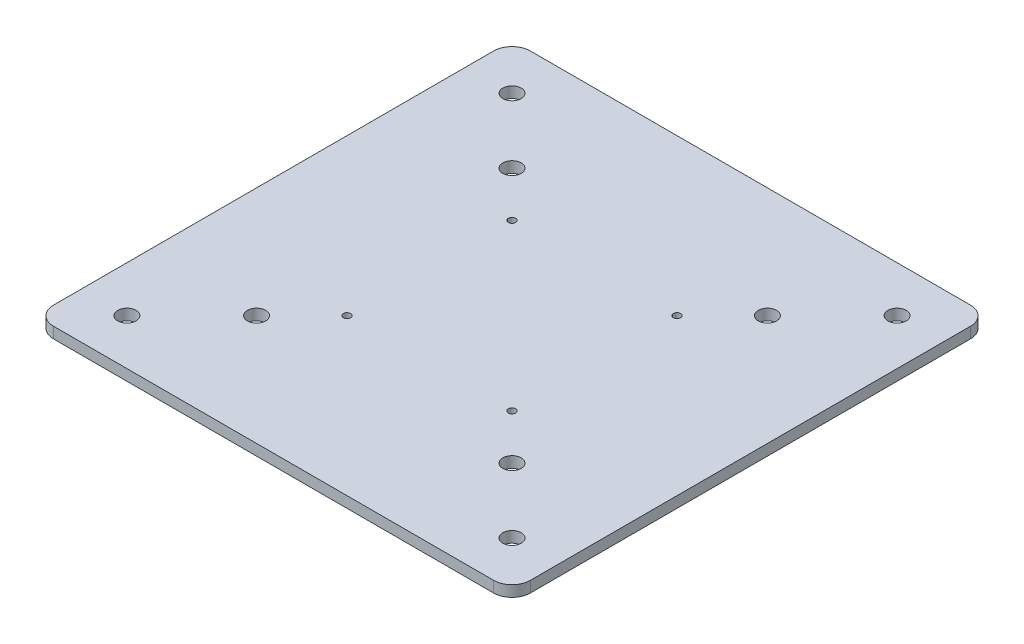
ISO-10303-21;
HEADER;
FILE_DESCRIPTION(('STEP AP214'),'2;1');
FILE_NAME('part.step','',(''),(''),'','','');
FILE_SCHEMA(('AUTOMOTIVE_DESIGN { 1 0 10303 214 1 1 1 1 }'));
ENDSEC;
DATA;
#1=APPLICATION_CONTEXT('core data for automotive mechanical design processes');
#2=APPLICATION_PROTOCOL_DEFINITION('international standard','automotive_design',2000,#1);
#3=PRODUCT_CONTEXT('',#1,'mechanical');
#4=PRODUCT('Part','Part','',(#3));
#5=PRODUCT_RELATED_PRODUCT_CATEGORY('part','',(#4));
#6=PRODUCT_DEFINITION_FORMATION('','',#4);
#7=PRODUCT_DEFINITION_CONTEXT('part definition',#1,'design');
#8=PRODUCT_DEFINITION('design','',#6,#7);
#9=PRODUCT_DEFINITION_SHAPE('','',#8);
#10=(LENGTH_UNIT() NAMED_UNIT(*) SI_UNIT(.MILLI.,.METRE.));
#11=(NAMED_UNIT(*) PLANE_ANGLE_UNIT() SI_UNIT($,.RADIAN.));
#12=(NAMED_UNIT(*) SI_UNIT($,.STERADIAN.) SOLID_ANGLE_UNIT());
#13=UNCERTAINTY_MEASURE_WITH_UNIT(LENGTH_MEASURE(1.E-05),#10,'distance_accuracy_value','');
#14=(GEOMETRIC_REPRESENTATION_CONTEXT(3) GLOBAL_UNCERTAINTY_ASSIGNED_CONTEXT((#13)) GLOBAL_UNIT_ASSIGNED_CONTEXT((#10,
#11,#12)) REPRESENTATION_CONTEXT('',''));
#15=CARTESIAN_POINT('',(0.,0.,0.));
#16=DIRECTION('',(0.,0.,1.));
#17=DIRECTION('',(1.,0.,0.));
#18=AXIS2_PLACEMENT_3D('',#15,#16,#17);
#19=CARTESIAN_POINT('',(0.,3.,0.));
#20=DIRECTION('',(0.,1.,0.));
#21=DIRECTION('',(0.,0.,1.));
#22=AXIS2_PLACEMENT_3D('',#19,#20,#21);
#23=PLANE('',#22);
#24=CARTESIAN_POINT('',(22.5,3.,22.4999999999999));
#25=DIRECTION('',(0.,1.,0.));
#26=DIRECTION('',(0.,0.,-1.));
#27=AXIS2_PLACEMENT_3D('',#24,#25,#26);
#28=CIRCLE('',#27,1.);
#29=CARTESIAN_POINT('',(22.5,3.,21.4999999999999));
#30=VERTEX_POINT('',#29);
#31=EDGE_CURVE('E309',#30,#30,#28,.T.);
#32=ORIENTED_EDGE('',*,*,#31,.F.);
#33=EDGE_LOOP('',(#32));
#34=FACE_BOUND('',#33,.T.);
#35=CARTESIAN_POINT('',(-22.5,3.,-22.5));
#36=DIRECTION('',(0.,1.,0.));
#37=DIRECTION('',(0.,0.,1.));
#38=AXIS2_PLACEMENT_3D('',#35,#36,#37);
#39=CIRCLE('',#38,1.);
#40=CARTESIAN_POINT('',(-22.5,3.,-21.5));
#41=VERTEX_POINT('',#40);
#42=EDGE_CURVE('E290',#41,#41,#39,.T.);
#43=ORIENTED_EDGE('',*,*,#42,.F.);
#44=EDGE_LOOP('',(#43));
#45=FACE_BOUND('',#44,.T.);
#46=CARTESIAN_POINT('',(-34.8223304703363,3.,34.8223304703363));
#47=DIRECTION('',(0.,1.,0.));
#48=DIRECTION('',(0.,0.,-1.));
#49=AXIS2_PLACEMENT_3D('',#46,#47,#48);
#50=CIRCLE('',#49,2.50000000000003);
#51=CARTESIAN_POINT('',(-34.8223304703363,3.,32.3223304703362));
#52=VERTEX_POINT('',#51);
#53=EDGE_CURVE('E273',#52,#52,#50,.T.);
#54=ORIENTED_EDGE('',*,*,#53,.F.);
#55=EDGE_LOOP('',(#54));
#56=FACE_BOUND('',#55,.T.);
#57=CARTESIAN_POINT('',(52.5,3.,52.4999999999999));
#58=DIRECTION('',(0.,1.,0.));
#59=DIRECTION('',(0.,0.,-1.));
#60=AXIS2_PLACEMENT_3D('',#57,#58,#59);
#61=CIRCLE('',#60,2.5);
#62=CARTESIAN_POINT('',(52.5,3.,49.9999999999999));
#63=VERTEX_POINT('',#62);
#64=EDGE_CURVE('E257',#63,#63,#61,.T.);
#65=ORIENTED_EDGE('',*,*,#64,.F.);
#66=EDGE_LOOP('',(#65));
#67=FACE_BOUND('',#66,.T.);
#68=CARTESIAN_POINT('',(34.8223304703363,3.,-34.8223304703363));
#69=DIRECTION('',(0.,1.,0.));
#70=DIRECTION('',(0.,0.,1.));
#71=AXIS2_PLACEMENT_3D('',#68,#69,#70);
#72=CIRCLE('',#71,2.5);
#73=CARTESIAN_POINT('',(34.8223304703363,3.,-32.3223304703363));
#74=VERTEX_POINT('',#73);
#75=EDGE_CURVE('E234',#74,#74,#72,.T.);
#76=ORIENTED_EDGE('',*,*,#75,.F.);
#77=EDGE_LOOP('',(#76));
#78=FACE_BOUND('',#77,.T.);
#79=CARTESIAN_POINT('',(-52.5,3.,-52.5));
#80=DIRECTION('',(0.,1.,0.));
#81=DIRECTION('',(0.,0.,1.));
#82=AXIS2_PLACEMENT_3D('',#79,#80,#81);
#83=CIRCLE('',#82,2.5);
#84=CARTESIAN_POINT('',(-52.5,3.,-50.));
#85=VERTEX_POINT('',#84);
#86=EDGE_CURVE('E217',#85,#85,#83,.T.);
#87=ORIENTED_EDGE('',*,*,#86,.F.);
#88=EDGE_LOOP('',(#87));
#89=FACE_BOUND('',#88,.T.);
#90=DIRECTION('',(0.,0.,1.));
#91=VECTOR('',#90,1.);
#92=CARTESIAN_POINT('',(-65.,3.,-65.));
#93=LINE('',#92,#91);
#94=CARTESIAN_POINT('',(-65.,3.,-60.));
#95=VERTEX_POINT('',#94);
#96=CARTESIAN_POINT('',(-65.,3.,60.));
#97=VERTEX_POINT('',#96);
#98=EDGE_CURVE('E179',#95,#97,#93,.T.);
#99=ORIENTED_EDGE('',*,*,#98,.T.);
#100=CARTESIAN_POINT('',(-60.,3.,60.));
#101=DIRECTION('',(0.,1.,0.));
#102=DIRECTION('',(0.,0.,1.));
#103=AXIS2_PLACEMENT_3D('',#100,#101,#102);
#104=CIRCLE('',#103,5.);
#105=CARTESIAN_POINT('',(-60.,3.,65.));
#106=VERTEX_POINT('',#105);
#107=EDGE_CURVE('E195',#97,#106,#104,.T.);
#108=ORIENTED_EDGE('',*,*,#107,.T.);
#109=DIRECTION('',(1.,0.,0.));
#110=VECTOR('',#109,1.);
#111=CARTESIAN_POINT('',(-65.,3.,65.));
#112=LINE('',#111,#110);
#113=CARTESIAN_POINT('',(60.,3.,65.));
#114=VERTEX_POINT('',#113);
#115=EDGE_CURVE('E129',#106,#114,#112,.T.);
#116=ORIENTED_EDGE('',*,*,#115,.T.);
#117=CARTESIAN_POINT('',(60.,3.,60.));
#118=DIRECTION('',(0.,1.,0.));
#119=DIRECTION('',(0.,0.,1.));
#120=AXIS2_PLACEMENT_3D('',#117,#118,#119);
#121=CIRCLE('',#120,5.);
#122=CARTESIAN_POINT('',(65.,3.,60.));
#123=VERTEX_POINT('',#122);
#124=EDGE_CURVE('E200',#114,#123,#121,.T.);
#125=ORIENTED_EDGE('',*,*,#124,.T.);
#126=DIRECTION('',(0.,0.,-1.));
#127=VECTOR('',#126,1.);
#128=CARTESIAN_POINT('',(65.,3.,-65.));
#129=LINE('',#128,#127);
#130=CARTESIAN_POINT('',(65.,3.,-60.));
#131=VERTEX_POINT('',#130);
#132=EDGE_CURVE('E138',#123,#131,#129,.T.);
#133=ORIENTED_EDGE('',*,*,#132,.T.);
#134=CARTESIAN_POINT('',(60.,3.,-60.));
#135=DIRECTION('',(0.,1.,0.));
#136=DIRECTION('',(0.,0.,1.));
#137=AXIS2_PLACEMENT_3D('',#134,#135,#136);
#138=CIRCLE('',#137,5.);
#139=CARTESIAN_POINT('',(60.,3.,-65.));
#140=VERTEX_POINT('',#139);
#141=EDGE_CURVE('E63',#131,#140,#138,.T.);
#142=ORIENTED_EDGE('',*,*,#141,.T.);
#143=DIRECTION('',(-1.,0.,0.));
#144=VECTOR('',#143,1.);
#145=CARTESIAN_POINT('',(-65.,3.,-65.));
#146=LINE('',#145,#144);
#147=CARTESIAN_POINT('',(-60.,3.,-65.));
#148=VERTEX_POINT('',#147);
#149=EDGE_CURVE('E143',#140,#148,#146,.T.);
#150=ORIENTED_EDGE('',*,*,#149,.T.);
#151=CARTESIAN_POINT('',(-60.,3.,-60.));
#152=DIRECTION('',(0.,1.,0.));
#153=DIRECTION('',(0.,0.,1.));
#154=AXIS2_PLACEMENT_3D('',#151,#152,#153);
#155=CIRCLE('',#154,5.);
#156=EDGE_CURVE('E166',#148,#95,#155,.T.);
#157=ORIENTED_EDGE('',*,*,#156,.T.);
#158=EDGE_LOOP('',(#99,#108,#116,#125,#133,#142,#150,#157));
#159=FACE_BOUND('',#158,.T.);
#160=CARTESIAN_POINT('',(-34.8223304703363,3.,-34.8223304703364));
#161=DIRECTION('',(0.,1.,0.));
#162=DIRECTION('',(0.,0.,1.));
#163=AXIS2_PLACEMENT_3D('',#160,#161,#162);
#164=CIRCLE('',#163,2.5);
#165=CARTESIAN_POINT('',(-34.8223304703363,3.,-32.3223304703364));
#166=VERTEX_POINT('',#165);
#167=EDGE_CURVE('E227',#166,#166,#164,.T.);
#168=ORIENTED_EDGE('',*,*,#167,.F.);
#169=EDGE_LOOP('',(#168));
#170=FACE_BOUND('',#169,.T.);
#171=CARTESIAN_POINT('',(52.5,3.,-52.5));
#172=DIRECTION('',(0.,1.,0.));
#173=DIRECTION('',(0.,0.,1.));
#174=AXIS2_PLACEMENT_3D('',#171,#172,#173);
#175=CIRCLE('',#174,2.5);
#176=CARTESIAN_POINT('',(52.5,3.,-50.));
#177=VERTEX_POINT('',#176);
#178=EDGE_CURVE('E246',#177,#177,#175,.T.);
#179=ORIENTED_EDGE('',*,*,#178,.F.);
#180=EDGE_LOOP('',(#179));
#181=FACE_BOUND('',#180,.T.);
#182=CARTESIAN_POINT('',(34.8223304703363,3.,34.8223304703362));
#183=DIRECTION('',(0.,1.,0.));
#184=DIRECTION('',(0.,0.,-1.));
#185=AXIS2_PLACEMENT_3D('',#182,#183,#184);
#186=CIRCLE('',#185,2.5);
#187=CARTESIAN_POINT('',(34.8223304703363,3.,32.3223304703362));
#188=VERTEX_POINT('',#187);
#189=EDGE_CURVE('E272',#188,#188,#186,.T.);
#190=ORIENTED_EDGE('',*,*,#189,.F.);
#191=EDGE_LOOP('',(#190));
#192=FACE_BOUND('',#191,.T.);
#193=CARTESIAN_POINT('',(-52.5,3.,52.5));
#194=DIRECTION('',(0.,1.,0.));
#195=DIRECTION('',(0.,0.,-1.));
#196=AXIS2_PLACEMENT_3D('',#193,#194,#195);
#197=CIRCLE('',#196,2.50000000000002);
#198=CARTESIAN_POINT('',(-52.5,3.,49.9999999999999));
#199=VERTEX_POINT('',#198);
#200=EDGE_CURVE('E281',#199,#199,#197,.T.);
#201=ORIENTED_EDGE('',*,*,#200,.F.);
#202=EDGE_LOOP('',(#201));
#203=FACE_BOUND('',#202,.T.);
#204=CARTESIAN_POINT('',(22.5,3.,-22.5));
#205=DIRECTION('',(0.,1.,0.));
#206=DIRECTION('',(0.,0.,1.));
#207=AXIS2_PLACEMENT_3D('',#204,#205,#206);
#208=CIRCLE('',#207,1.);
#209=CARTESIAN_POINT('',(22.5,3.,-21.5));
#210=VERTEX_POINT('',#209);
#211=EDGE_CURVE('E298',#210,#210,#208,.T.);
#212=ORIENTED_EDGE('',*,*,#211,.F.);
#213=EDGE_LOOP('',(#212));
#214=FACE_BOUND('',#213,.T.);
#215=CARTESIAN_POINT('',(-22.5,3.,22.4999999999999));
#216=DIRECTION('',(0.,1.,0.));
#217=DIRECTION('',(0.,0.,-1.));
#218=AXIS2_PLACEMENT_3D('',#215,#216,#217);
#219=CIRCLE('',#218,1.);
#220=CARTESIAN_POINT('',(-22.5,3.,21.4999999999999));
#221=VERTEX_POINT('',#220);
#222=EDGE_CURVE('E321',#221,#221,#219,.T.);
#223=ORIENTED_EDGE('',*,*,#222,.F.);
#224=EDGE_LOOP('',(#223));
#225=FACE_BOUND('',#224,.T.);
#226=ADVANCED_FACE('F42',(#34,#45,#56,#67,#78,#89,#159,#170,#181,#192,#203,#214,#225),#23,.T.);
#227=CARTESIAN_POINT('',(0.,0.,0.));
#228=DIRECTION('',(0.,1.,0.));
#229=DIRECTION('',(0.,0.,1.));
#230=AXIS2_PLACEMENT_3D('',#227,#228,#229);
#231=PLANE('',#230);
#232=DIRECTION('',(1.,0.,0.));
#233=VECTOR('',#232,1.);
#234=CARTESIAN_POINT('',(-65.,0.,65.));
#235=LINE('',#234,#233);
#236=CARTESIAN_POINT('',(-60.,0.,65.));
#237=VERTEX_POINT('',#236);
#238=CARTESIAN_POINT('',(60.,0.,65.));
#239=VERTEX_POINT('',#238);
#240=EDGE_CURVE('E126',#237,#239,#235,.T.);
#241=ORIENTED_EDGE('',*,*,#240,.F.);
#242=CARTESIAN_POINT('',(-60.,0.,60.));
#243=DIRECTION('',(0.,1.,0.));
#244=DIRECTION('',(0.,0.,1.));
#245=AXIS2_PLACEMENT_3D('',#242,#243,#244);
#246=CIRCLE('',#245,5.);
#247=CARTESIAN_POINT('',(-65.,0.,60.));
#248=VERTEX_POINT('',#247);
#249=EDGE_CURVE('E108',#237,#248,#246,.F.);
#250=ORIENTED_EDGE('',*,*,#249,.T.);
#251=DIRECTION('',(0.,0.,1.));
#252=VECTOR('',#251,1.);
#253=CARTESIAN_POINT('',(-65.,0.,-65.));
#254=LINE('',#253,#252);
#255=CARTESIAN_POINT('',(-65.,0.,-60.));
#256=VERTEX_POINT('',#255);
#257=EDGE_CURVE('E139',#256,#248,#254,.T.);
#258=ORIENTED_EDGE('',*,*,#257,.F.);
#259=CARTESIAN_POINT('',(-60.,0.,-60.));
#260=DIRECTION('',(0.,1.,0.));
#261=DIRECTION('',(0.,0.,1.));
#262=AXIS2_PLACEMENT_3D('',#259,#260,#261);
#263=CIRCLE('',#262,5.);
#264=CARTESIAN_POINT('',(-60.,0.,-65.));
#265=VERTEX_POINT('',#264);
#266=EDGE_CURVE('E153',#256,#265,#263,.F.);
#267=ORIENTED_EDGE('',*,*,#266,.T.);
#268=DIRECTION('',(-1.,0.,0.));
#269=VECTOR('',#268,1.);
#270=CARTESIAN_POINT('',(-65.,0.,-65.));
#271=LINE('',#270,#269);
#272=CARTESIAN_POINT('',(60.,0.,-65.));
#273=VERTEX_POINT('',#272);
#274=EDGE_CURVE('E145',#273,#265,#271,.T.);
#275=ORIENTED_EDGE('',*,*,#274,.F.);
#276=CARTESIAN_POINT('',(60.,0.,-60.));
#277=DIRECTION('',(0.,1.,0.));
#278=DIRECTION('',(0.,0.,1.));
#279=AXIS2_PLACEMENT_3D('',#276,#277,#278);
#280=CIRCLE('',#279,5.);
#281=CARTESIAN_POINT('',(65.,0.,-60.));
#282=VERTEX_POINT('',#281);
#283=EDGE_CURVE('E131',#273,#282,#280,.F.);
#284=ORIENTED_EDGE('',*,*,#283,.T.);
#285=DIRECTION('',(0.,0.,-1.));
#286=VECTOR('',#285,1.);
#287=CARTESIAN_POINT('',(65.,0.,-65.));
#288=LINE('',#287,#286);
#289=CARTESIAN_POINT('',(65.,0.,60.));
#290=VERTEX_POINT('',#289);
#291=EDGE_CURVE('E215',#290,#282,#288,.T.);
#292=ORIENTED_EDGE('',*,*,#291,.F.);
#293=CARTESIAN_POINT('',(60.,0.,60.));
#294=DIRECTION('',(0.,1.,0.));
#295=DIRECTION('',(0.,0.,1.));
#296=AXIS2_PLACEMENT_3D('',#293,#294,#295);
#297=CIRCLE('',#296,5.);
#298=EDGE_CURVE('E120',#290,#239,#297,.F.);
#299=ORIENTED_EDGE('',*,*,#298,.T.);
#300=EDGE_LOOP('',(#241,#250,#258,#267,#275,#284,#292,#299));
#301=FACE_BOUND('',#300,.T.);
#302=CARTESIAN_POINT('',(-52.5,0.,-52.5));
#303=DIRECTION('',(0.,1.,0.));
#304=DIRECTION('',(0.,0.,1.));
#305=AXIS2_PLACEMENT_3D('',#302,#303,#304);
#306=CIRCLE('',#305,2.5);
#307=CARTESIAN_POINT('',(-52.5,0.,-50.));
#308=VERTEX_POINT('',#307);
#309=EDGE_CURVE('E222',#308,#308,#306,.T.);
#310=ORIENTED_EDGE('',*,*,#309,.T.);
#311=EDGE_LOOP('',(#310));
#312=FACE_BOUND('',#311,.T.);
#313=CARTESIAN_POINT('',(-34.8223304703363,0.,-34.8223304703364));
#314=DIRECTION('',(0.,1.,0.));
#315=DIRECTION('',(0.,0.,1.));
#316=AXIS2_PLACEMENT_3D('',#313,#314,#315);
#317=CIRCLE('',#316,2.5);
#318=CARTESIAN_POINT('',(-34.8223304703363,0.,-32.3223304703364));
#319=VERTEX_POINT('',#318);
#320=EDGE_CURVE('E230',#319,#319,#317,.T.);
#321=ORIENTED_EDGE('',*,*,#320,.T.);
#322=EDGE_LOOP('',(#321));
#323=FACE_BOUND('',#322,.T.);
#324=CARTESIAN_POINT('',(34.8223304703363,0.,-34.8223304703363));
#325=DIRECTION('',(0.,1.,0.));
#326=DIRECTION('',(0.,0.,1.));
#327=AXIS2_PLACEMENT_3D('',#324,#325,#326);
#328=CIRCLE('',#327,2.5);
#329=CARTESIAN_POINT('',(34.8223304703363,0.,-32.3223304703363));
#330=VERTEX_POINT('',#329);
#331=EDGE_CURVE('E239',#330,#330,#328,.T.);
#332=ORIENTED_EDGE('',*,*,#331,.T.);
#333=EDGE_LOOP('',(#332));
#334=FACE_BOUND('',#333,.T.);
#335=CARTESIAN_POINT('',(52.5,0.,-52.5));
#336=DIRECTION('',(0.,1.,0.));
#337=DIRECTION('',(0.,0.,1.));
#338=AXIS2_PLACEMENT_3D('',#335,#336,#337);
#339=CIRCLE('',#338,2.5);
#340=CARTESIAN_POINT('',(52.5,0.,-50.));
#341=VERTEX_POINT('',#340);
#342=EDGE_CURVE('E252',#341,#341,#339,.T.);
#343=ORIENTED_EDGE('',*,*,#342,.T.);
#344=EDGE_LOOP('',(#343));
#345=FACE_BOUND('',#344,.T.);
#346=CARTESIAN_POINT('',(52.5,0.,52.4999999999999));
#347=DIRECTION('',(0.,1.,0.));
#348=DIRECTION('',(0.,0.,-1.));
#349=AXIS2_PLACEMENT_3D('',#346,#347,#348);
#350=CIRCLE('',#349,2.5);
#351=CARTESIAN_POINT('',(52.5,0.,49.9999999999999));
#352=VERTEX_POINT('',#351);
#353=EDGE_CURVE('E253',#352,#352,#350,.T.);
#354=ORIENTED_EDGE('',*,*,#353,.T.);
#355=EDGE_LOOP('',(#354));
#356=FACE_BOUND('',#355,.T.);
#357=CARTESIAN_POINT('',(34.8223304703363,0.,34.8223304703362));
#358=DIRECTION('',(0.,1.,0.));
#359=DIRECTION('',(0.,0.,-1.));
#360=AXIS2_PLACEMENT_3D('',#357,#358,#359);
#361=CIRCLE('',#360,2.5);
#362=CARTESIAN_POINT('',(34.8223304703363,0.,32.3223304703362));
#363=VERTEX_POINT('',#362);
#364=EDGE_CURVE('E269',#363,#363,#361,.T.);
#365=ORIENTED_EDGE('',*,*,#364,.T.);
#366=EDGE_LOOP('',(#365));
#367=FACE_BOUND('',#366,.T.);
#368=CARTESIAN_POINT('',(-34.8223304703363,0.,34.8223304703363));
#369=DIRECTION('',(0.,1.,0.));
#370=DIRECTION('',(0.,0.,-1.));
#371=AXIS2_PLACEMENT_3D('',#368,#369,#370);
#372=CIRCLE('',#371,2.50000000000003);
#373=CARTESIAN_POINT('',(-34.8223304703363,0.,32.3223304703362));
#374=VERTEX_POINT('',#373);
#375=EDGE_CURVE('E278',#374,#374,#372,.T.);
#376=ORIENTED_EDGE('',*,*,#375,.T.);
#377=EDGE_LOOP('',(#376));
#378=FACE_BOUND('',#377,.T.);
#379=CARTESIAN_POINT('',(-52.5,0.,52.5));
#380=DIRECTION('',(0.,1.,0.));
#381=DIRECTION('',(0.,0.,-1.));
#382=AXIS2_PLACEMENT_3D('',#379,#380,#381);
#383=CIRCLE('',#382,2.50000000000002);
#384=CARTESIAN_POINT('',(-52.5,0.,49.9999999999999));
#385=VERTEX_POINT('',#384);
#386=EDGE_CURVE('E286',#385,#385,#383,.T.);
#387=ORIENTED_EDGE('',*,*,#386,.T.);
#388=EDGE_LOOP('',(#387));
#389=FACE_BOUND('',#388,.T.);
#390=CARTESIAN_POINT('',(-22.5,0.,-22.5));
#391=DIRECTION('',(0.,1.,0.));
#392=DIRECTION('',(0.,0.,1.));
#393=AXIS2_PLACEMENT_3D('',#390,#391,#392);
#394=CIRCLE('',#393,1.);
#395=CARTESIAN_POINT('',(-22.5,0.,-21.5));
#396=VERTEX_POINT('',#395);
#397=EDGE_CURVE('E295',#396,#396,#394,.T.);
#398=ORIENTED_EDGE('',*,*,#397,.T.);
#399=EDGE_LOOP('',(#398));
#400=FACE_BOUND('',#399,.T.);
#401=CARTESIAN_POINT('',(22.5,0.,-22.5));
#402=DIRECTION('',(0.,1.,0.));
#403=DIRECTION('',(0.,0.,1.));
#404=AXIS2_PLACEMENT_3D('',#401,#402,#403);
#405=CIRCLE('',#404,1.);
#406=CARTESIAN_POINT('',(22.5,0.,-21.5));
#407=VERTEX_POINT('',#406);
#408=EDGE_CURVE('E304',#407,#407,#405,.T.);
#409=ORIENTED_EDGE('',*,*,#408,.T.);
#410=EDGE_LOOP('',(#409));
#411=FACE_BOUND('',#410,.T.);
#412=CARTESIAN_POINT('',(22.5,0.,22.4999999999999));
#413=DIRECTION('',(0.,1.,0.));
#414=DIRECTION('',(0.,0.,-1.));
#415=AXIS2_PLACEMENT_3D('',#412,#413,#414);
#416=CIRCLE('',#415,1.);
#417=CARTESIAN_POINT('',(22.5,0.,21.4999999999999));
#418=VERTEX_POINT('',#417);
#419=EDGE_CURVE('E305',#418,#418,#416,.T.);
#420=ORIENTED_EDGE('',*,*,#419,.T.);
#421=EDGE_LOOP('',(#420));
#422=FACE_BOUND('',#421,.T.);
#423=CARTESIAN_POINT('',(-22.5,0.,22.4999999999999));
#424=DIRECTION('',(0.,1.,0.));
#425=DIRECTION('',(0.,0.,-1.));
#426=AXIS2_PLACEMENT_3D('',#423,#424,#425);
#427=CIRCLE('',#426,1.);
#428=CARTESIAN_POINT('',(-22.5,0.,21.4999999999999));
#429=VERTEX_POINT('',#428);
#430=EDGE_CURVE('E318',#429,#429,#427,.T.);
#431=ORIENTED_EDGE('',*,*,#430,.T.);
#432=EDGE_LOOP('',(#431));
#433=FACE_BOUND('',#432,.T.);
#434=ADVANCED_FACE('F134',(#301,#312,#323,#334,#345,#356,#367,#378,#389,#400,#411,#422,#433),
#231,.F.);
#435=CARTESIAN_POINT('',(65.,3.,-65.));
#436=DIRECTION('',(-1.,0.,0.));
#437=DIRECTION('',(0.,0.,1.));
#438=AXIS2_PLACEMENT_3D('',#435,#436,#437);
#439=PLANE('',#438);
#440=ORIENTED_EDGE('',*,*,#132,.F.);
#441=DIRECTION('',(0.,-1.,0.));
#442=VECTOR('',#441,1.);
#443=CARTESIAN_POINT('',(65.,3.,60.));
#444=LINE('',#443,#442);
#445=EDGE_CURVE('E204',#123,#290,#444,.T.);
#446=ORIENTED_EDGE('',*,*,#445,.T.);
#447=ORIENTED_EDGE('',*,*,#291,.T.);
#448=DIRECTION('',(0.,-1.,0.));
#449=VECTOR('',#448,1.);
#450=CARTESIAN_POINT('',(65.,3.,-60.));
#451=LINE('',#450,#449);
#452=EDGE_CURVE('E199',#282,#131,#451,.F.);
#453=ORIENTED_EDGE('',*,*,#452,.T.);
#454=EDGE_LOOP('',(#440,#446,#447,#453));
#455=FACE_BOUND('',#454,.T.);
#456=ADVANCED_FACE('F353',(#455),#439,.F.);
#457=CARTESIAN_POINT('',(-65.,3.,-65.));
#458=DIRECTION('',(0.,0.,1.));
#459=DIRECTION('',(1.,0.,0.));
#460=AXIS2_PLACEMENT_3D('',#457,#458,#459);
#461=PLANE('',#460);
#462=ORIENTED_EDGE('',*,*,#274,.T.);
#463=DIRECTION('',(0.,-1.,0.));
#464=VECTOR('',#463,1.);
#465=CARTESIAN_POINT('',(-60.,3.,-65.));
#466=LINE('',#465,#464);
#467=EDGE_CURVE('E12',#265,#148,#466,.F.);
#468=ORIENTED_EDGE('',*,*,#467,.T.);
#469=ORIENTED_EDGE('',*,*,#149,.F.);
#470=DIRECTION('',(0.,-1.,0.));
#471=VECTOR('',#470,1.);
#472=CARTESIAN_POINT('',(60.,3.,-65.));
#473=LINE('',#472,#471);
#474=EDGE_CURVE('E51',#140,#273,#473,.T.);
#475=ORIENTED_EDGE('',*,*,#474,.T.);
#476=EDGE_LOOP('',(#462,#468,#469,#475));
#477=FACE_BOUND('',#476,.T.);
#478=ADVANCED_FACE('F211',(#477),#461,.F.);
#479=CARTESIAN_POINT('',(-65.,3.,-65.));
#480=DIRECTION('',(1.,0.,0.));
#481=DIRECTION('',(0.,0.,-1.));
#482=AXIS2_PLACEMENT_3D('',#479,#480,#481);
#483=PLANE('',#482);
#484=ORIENTED_EDGE('',*,*,#257,.T.);
#485=DIRECTION('',(0.,-1.,0.));
#486=VECTOR('',#485,1.);
#487=CARTESIAN_POINT('',(-65.,3.,60.));
#488=LINE('',#487,#486);
#489=EDGE_CURVE('E113',#248,#97,#488,.F.);
#490=ORIENTED_EDGE('',*,*,#489,.T.);
#491=ORIENTED_EDGE('',*,*,#98,.F.);
#492=DIRECTION('',(0.,-1.,0.));
#493=VECTOR('',#492,1.);
#494=CARTESIAN_POINT('',(-65.,3.,-60.));
#495=LINE('',#494,#493);
#496=EDGE_CURVE('E119',#95,#256,#495,.T.);
#497=ORIENTED_EDGE('',*,*,#496,.T.);
#498=EDGE_LOOP('',(#484,#490,#491,#497));
#499=FACE_BOUND('',#498,.T.);
#500=ADVANCED_FACE('F363',(#499),#483,.F.);
#501=CARTESIAN_POINT('',(-65.,3.,65.));
#502=DIRECTION('',(0.,0.,-1.));
#503=DIRECTION('',(-1.,0.,0.));
#504=AXIS2_PLACEMENT_3D('',#501,#502,#503);
#505=PLANE('',#504);
#506=ORIENTED_EDGE('',*,*,#115,.F.);
#507=DIRECTION('',(0.,-1.,0.));
#508=VECTOR('',#507,1.);
#509=CARTESIAN_POINT('',(-60.,3.,65.));
#510=LINE('',#509,#508);
#511=EDGE_CURVE('E112',#106,#237,#510,.T.);
#512=ORIENTED_EDGE('',*,*,#511,.T.);
#513=ORIENTED_EDGE('',*,*,#240,.T.);
#514=DIRECTION('',(0.,-1.,0.));
#515=VECTOR('',#514,1.);
#516=CARTESIAN_POINT('',(60.,3.,65.));
#517=LINE('',#516,#515);
#518=EDGE_CURVE('E132',#239,#114,#517,.F.);
#519=ORIENTED_EDGE('',*,*,#518,.T.);
#520=EDGE_LOOP('',(#506,#512,#513,#519));
#521=FACE_BOUND('',#520,.T.);
#522=ADVANCED_FACE('F125',(#521),#505,.F.);
#523=CARTESIAN_POINT('',(-52.5,3.,-52.5));
#524=DIRECTION('',(0.,-1.,0.));
#525=DIRECTION('',(0.,0.,-1.));
#526=AXIS2_PLACEMENT_3D('',#523,#524,#525);
#527=CYLINDRICAL_SURFACE('',#526,2.5);
#528=ORIENTED_EDGE('',*,*,#86,.T.);
#529=EDGE_LOOP('',(#528));
#530=FACE_BOUND('',#529,.T.);
#531=ORIENTED_EDGE('',*,*,#309,.F.);
#532=EDGE_LOOP('',(#531));
#533=FACE_BOUND('',#532,.T.);
#534=ADVANCED_FACE('F358',(#530,#533),#527,.F.);
#535=CARTESIAN_POINT('',(-34.8223304703363,3.,-34.8223304703364));
#536=DIRECTION('',(0.,-1.,0.));
#537=DIRECTION('',(0.,0.,-1.));
#538=AXIS2_PLACEMENT_3D('',#535,#536,#537);
#539=CYLINDRICAL_SURFACE('',#538,2.5);
#540=ORIENTED_EDGE('',*,*,#167,.T.);
#541=EDGE_LOOP('',(#540));
#542=FACE_BOUND('',#541,.T.);
#543=ORIENTED_EDGE('',*,*,#320,.F.);
#544=EDGE_LOOP('',(#543));
#545=FACE_BOUND('',#544,.T.);
#546=ADVANCED_FACE('F429',(#542,#545),#539,.F.);
#547=CARTESIAN_POINT('',(34.8223304703363,3.,-34.8223304703363));
#548=DIRECTION('',(0.,-1.,0.));
#549=DIRECTION('',(0.,0.,-1.));
#550=AXIS2_PLACEMENT_3D('',#547,#548,#549);
#551=CYLINDRICAL_SURFACE('',#550,2.5);
#552=ORIENTED_EDGE('',*,*,#75,.T.);
#553=EDGE_LOOP('',(#552));
#554=FACE_BOUND('',#553,.T.);
#555=ORIENTED_EDGE('',*,*,#331,.F.);
#556=EDGE_LOOP('',(#555));
#557=FACE_BOUND('',#556,.T.);
#558=ADVANCED_FACE('F426',(#554,#557),#551,.F.);
#559=CARTESIAN_POINT('',(52.5,3.,-52.5));
#560=DIRECTION('',(0.,-1.,0.));
#561=DIRECTION('',(0.,0.,-1.));
#562=AXIS2_PLACEMENT_3D('',#559,#560,#561);
#563=CYLINDRICAL_SURFACE('',#562,2.5);
#564=ORIENTED_EDGE('',*,*,#178,.T.);
#565=EDGE_LOOP('',(#564));
#566=FACE_BOUND('',#565,.T.);
#567=ORIENTED_EDGE('',*,*,#342,.F.);
#568=EDGE_LOOP('',(#567));
#569=FACE_BOUND('',#568,.T.);
#570=ADVANCED_FACE('F428',(#566,#569),#563,.F.);
#571=CARTESIAN_POINT('',(52.5,3.,52.4999999999999));
#572=DIRECTION('',(0.,-1.,0.));
#573=DIRECTION('',(0.,0.,-1.));
#574=AXIS2_PLACEMENT_3D('',#571,#572,#573);
#575=CYLINDRICAL_SURFACE('',#574,2.5);
#576=ORIENTED_EDGE('',*,*,#64,.T.);
#577=EDGE_LOOP('',(#576));
#578=FACE_BOUND('',#577,.T.);
#579=ORIENTED_EDGE('',*,*,#353,.F.);
#580=EDGE_LOOP('',(#579));
#581=FACE_BOUND('',#580,.T.);
#582=ADVANCED_FACE('F436',(#578,#581),#575,.F.);
#583=CARTESIAN_POINT('',(34.8223304703363,3.,34.8223304703362));
#584=DIRECTION('',(0.,-1.,0.));
#585=DIRECTION('',(0.,0.,-1.));
#586=AXIS2_PLACEMENT_3D('',#583,#584,#585);
#587=CYLINDRICAL_SURFACE('',#586,2.5);
#588=ORIENTED_EDGE('',*,*,#189,.T.);
#589=EDGE_LOOP('',(#588));
#590=FACE_BOUND('',#589,.T.);
#591=ORIENTED_EDGE('',*,*,#364,.F.);
#592=EDGE_LOOP('',(#591));
#593=FACE_BOUND('',#592,.T.);
#594=ADVANCED_FACE('F443',(#590,#593),#587,.F.);
#595=CARTESIAN_POINT('',(-34.8223304703363,3.,34.8223304703363));
#596=DIRECTION('',(0.,-1.,0.));
#597=DIRECTION('',(0.,0.,-1.));
#598=AXIS2_PLACEMENT_3D('',#595,#596,#597);
#599=CYLINDRICAL_SURFACE('',#598,2.50000000000003);
#600=ORIENTED_EDGE('',*,*,#53,.T.);
#601=EDGE_LOOP('',(#600));
#602=FACE_BOUND('',#601,.T.);
#603=ORIENTED_EDGE('',*,*,#375,.F.);
#604=EDGE_LOOP('',(#603));
#605=FACE_BOUND('',#604,.T.);
#606=ADVANCED_FACE('F409',(#602,#605),#599,.F.);
#607=CARTESIAN_POINT('',(-52.5,3.,52.5));
#608=DIRECTION('',(0.,-1.,0.));
#609=DIRECTION('',(0.,0.,-1.));
#610=AXIS2_PLACEMENT_3D('',#607,#608,#609);
#611=CYLINDRICAL_SURFACE('',#610,2.50000000000002);
#612=ORIENTED_EDGE('',*,*,#200,.T.);
#613=EDGE_LOOP('',(#612));
#614=FACE_BOUND('',#613,.T.);
#615=ORIENTED_EDGE('',*,*,#386,.F.);
#616=EDGE_LOOP('',(#615));
#617=FACE_BOUND('',#616,.T.);
#618=ADVANCED_FACE('F406',(#614,#617),#611,.F.);
#619=CARTESIAN_POINT('',(-22.5,3.,-22.5));
#620=DIRECTION('',(0.,-1.,0.));
#621=DIRECTION('',(0.,0.,-1.));
#622=AXIS2_PLACEMENT_3D('',#619,#620,#621);
#623=CYLINDRICAL_SURFACE('',#622,1.);
#624=ORIENTED_EDGE('',*,*,#42,.T.);
#625=EDGE_LOOP('',(#624));
#626=FACE_BOUND('',#625,.T.);
#627=ORIENTED_EDGE('',*,*,#397,.F.);
#628=EDGE_LOOP('',(#627));
#629=FACE_BOUND('',#628,.T.);
#630=ADVANCED_FACE('F344',(#626,#629),#623,.F.);
#631=CARTESIAN_POINT('',(22.5,3.,-22.5));
#632=DIRECTION('',(0.,-1.,0.));
#633=DIRECTION('',(0.,0.,-1.));
#634=AXIS2_PLACEMENT_3D('',#631,#632,#633);
#635=CYLINDRICAL_SURFACE('',#634,1.);
#636=ORIENTED_EDGE('',*,*,#211,.T.);
#637=EDGE_LOOP('',(#636));
#638=FACE_BOUND('',#637,.T.);
#639=ORIENTED_EDGE('',*,*,#408,.F.);
#640=EDGE_LOOP('',(#639));
#641=FACE_BOUND('',#640,.T.);
#642=ADVANCED_FACE('F336',(#638,#641),#635,.F.);
#643=CARTESIAN_POINT('',(22.5,3.,22.4999999999999));
#644=DIRECTION('',(0.,-1.,0.));
#645=DIRECTION('',(0.,0.,-1.));
#646=AXIS2_PLACEMENT_3D('',#643,#644,#645);
#647=CYLINDRICAL_SURFACE('',#646,1.);
#648=ORIENTED_EDGE('',*,*,#31,.T.);
#649=EDGE_LOOP('',(#648));
#650=FACE_BOUND('',#649,.T.);
#651=ORIENTED_EDGE('',*,*,#419,.F.);
#652=EDGE_LOOP('',(#651));
#653=FACE_BOUND('',#652,.T.);
#654=ADVANCED_FACE('F333',(#650,#653),#647,.F.);
#655=CARTESIAN_POINT('',(-22.5,3.,22.4999999999999));
#656=DIRECTION('',(0.,-1.,0.));
#657=DIRECTION('',(0.,0.,-1.));
#658=AXIS2_PLACEMENT_3D('',#655,#656,#657);
#659=CYLINDRICAL_SURFACE('',#658,1.);
#660=ORIENTED_EDGE('',*,*,#222,.T.);
#661=EDGE_LOOP('',(#660));
#662=FACE_BOUND('',#661,.T.);
#663=ORIENTED_EDGE('',*,*,#430,.F.);
#664=EDGE_LOOP('',(#663));
#665=FACE_BOUND('',#664,.T.);
#666=ADVANCED_FACE('F335',(#662,#665),#659,.F.);
#667=CARTESIAN_POINT('',(-60.,3.,60.));
#668=DIRECTION('',(0.,-1.,0.));
#669=DIRECTION('',(0.,0.,-1.));
#670=AXIS2_PLACEMENT_3D('',#667,#668,#669);
#671=CYLINDRICAL_SURFACE('',#670,5.);
#672=ORIENTED_EDGE('',*,*,#107,.F.);
#673=ORIENTED_EDGE('',*,*,#489,.F.);
#674=ORIENTED_EDGE('',*,*,#249,.F.);
#675=ORIENTED_EDGE('',*,*,#511,.F.);
#676=EDGE_LOOP('',(#672,#673,#674,#675));
#677=FACE_BOUND('',#676,.T.);
#678=ADVANCED_FACE('F111',(#677),#671,.T.);
#679=CARTESIAN_POINT('',(60.,3.,60.));
#680=DIRECTION('',(0.,-1.,0.));
#681=DIRECTION('',(0.,0.,-1.));
#682=AXIS2_PLACEMENT_3D('',#679,#680,#681);
#683=CYLINDRICAL_SURFACE('',#682,5.);
#684=ORIENTED_EDGE('',*,*,#124,.F.);
#685=ORIENTED_EDGE('',*,*,#518,.F.);
#686=ORIENTED_EDGE('',*,*,#298,.F.);
#687=ORIENTED_EDGE('',*,*,#445,.F.);
#688=EDGE_LOOP('',(#684,#685,#686,#687));
#689=FACE_BOUND('',#688,.T.);
#690=ADVANCED_FACE('F373',(#689),#683,.T.);
#691=CARTESIAN_POINT('',(-60.,3.,-60.));
#692=DIRECTION('',(0.,-1.,0.));
#693=DIRECTION('',(0.,0.,-1.));
#694=AXIS2_PLACEMENT_3D('',#691,#692,#693);
#695=CYLINDRICAL_SURFACE('',#694,5.);
#696=ORIENTED_EDGE('',*,*,#156,.F.);
#697=ORIENTED_EDGE('',*,*,#467,.F.);
#698=ORIENTED_EDGE('',*,*,#266,.F.);
#699=ORIENTED_EDGE('',*,*,#496,.F.);
#700=EDGE_LOOP('',(#696,#697,#698,#699));
#701=FACE_BOUND('',#700,.T.);
#702=ADVANCED_FACE('F375',(#701),#695,.T.);
#703=CARTESIAN_POINT('',(60.,3.,-60.));
#704=DIRECTION('',(0.,-1.,0.));
#705=DIRECTION('',(0.,0.,-1.));
#706=AXIS2_PLACEMENT_3D('',#703,#704,#705);
#707=CYLINDRICAL_SURFACE('',#706,5.);
#708=ORIENTED_EDGE('',*,*,#141,.F.);
#709=ORIENTED_EDGE('',*,*,#452,.F.);
#710=ORIENTED_EDGE('',*,*,#283,.F.);
#711=ORIENTED_EDGE('',*,*,#474,.F.);
#712=EDGE_LOOP('',(#708,#709,#710,#711));
#713=FACE_BOUND('',#712,.T.);
#714=ADVANCED_FACE('F44',(#713),#707,.T.);
#715=CLOSED_SHELL('',(#226,#434,#456,#478,#500,#522,#534,#546,#558,#570,#582,#594,#606,#618,
#630,#642,#654,#666,#678,#690,#702,#714));
#716=MANIFOLD_SOLID_BREP('B2',#715);
#717=ADVANCED_BREP_SHAPE_REPRESENTATION('',(#18,#716),#14);
#718=SHAPE_DEFINITION_REPRESENTATION(#9,#717);
ENDSEC;
END-ISO-10303-21;
